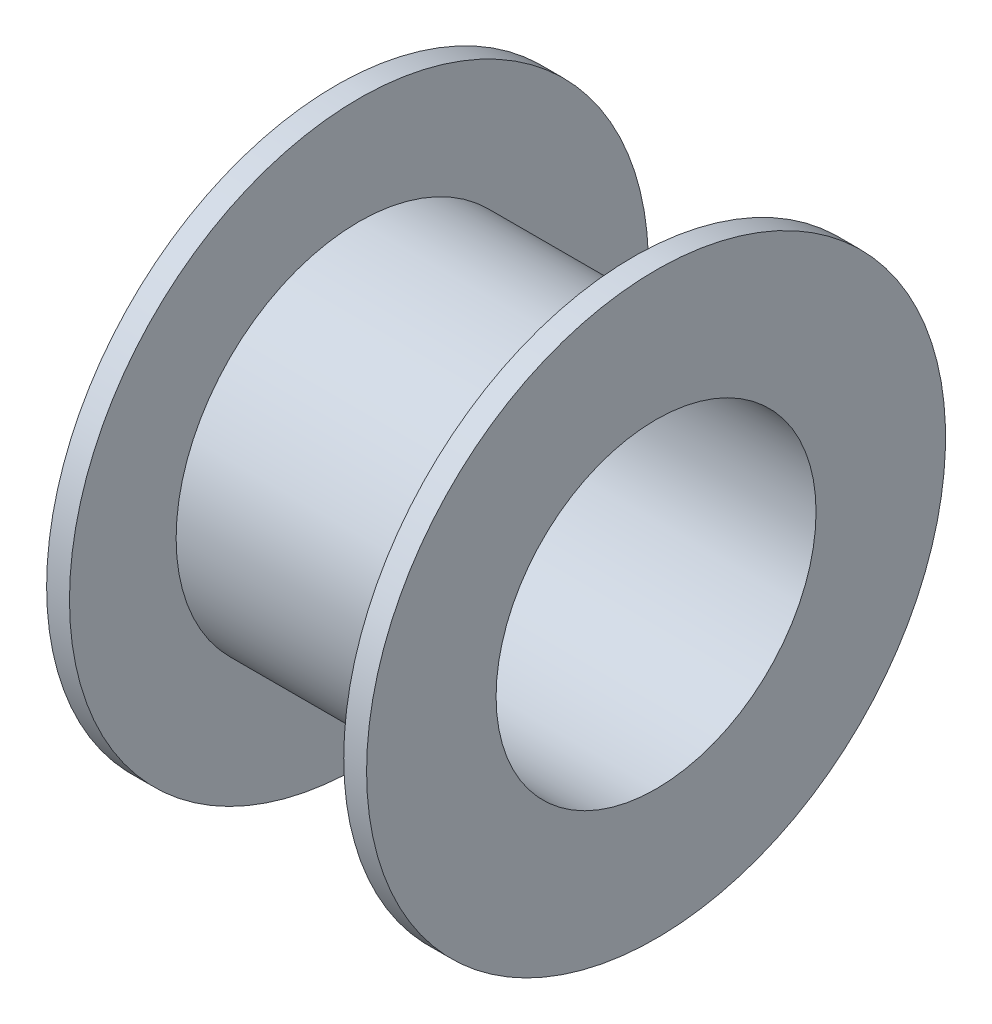
ISO-10303-21;
HEADER;
FILE_DESCRIPTION(('STEP AP214'),'2;1');
FILE_NAME('part.step','',(''),(''),'','','');
FILE_SCHEMA(('AUTOMOTIVE_DESIGN { 1 0 10303 214 1 1 1 1 }'));
ENDSEC;
DATA;
#1=APPLICATION_CONTEXT('core data for automotive mechanical design processes');
#2=APPLICATION_PROTOCOL_DEFINITION('international standard','automotive_design',2000,#1);
#3=PRODUCT_CONTEXT('',#1,'mechanical');
#4=PRODUCT('Part','Part','',(#3));
#5=PRODUCT_RELATED_PRODUCT_CATEGORY('part','',(#4));
#6=PRODUCT_DEFINITION_FORMATION('','',#4);
#7=PRODUCT_DEFINITION_CONTEXT('part definition',#1,'design');
#8=PRODUCT_DEFINITION('design','',#6,#7);
#9=PRODUCT_DEFINITION_SHAPE('','',#8);
#10=(LENGTH_UNIT() NAMED_UNIT(*) SI_UNIT(.MILLI.,.METRE.));
#11=(NAMED_UNIT(*) PLANE_ANGLE_UNIT() SI_UNIT($,.RADIAN.));
#12=(NAMED_UNIT(*) SI_UNIT($,.STERADIAN.) SOLID_ANGLE_UNIT());
#13=UNCERTAINTY_MEASURE_WITH_UNIT(LENGTH_MEASURE(1.E-05),#10,'distance_accuracy_value','');
#14=(GEOMETRIC_REPRESENTATION_CONTEXT(3) GLOBAL_UNCERTAINTY_ASSIGNED_CONTEXT((#13)) GLOBAL_UNIT_ASSIGNED_CONTEXT((#10,
#11,#12)) REPRESENTATION_CONTEXT('',''));
#15=CARTESIAN_POINT('',(0.,0.,0.));
#16=DIRECTION('',(0.,0.,1.));
#17=DIRECTION('',(1.,0.,0.));
#18=AXIS2_PLACEMENT_3D('',#15,#16,#17);
#19=CARTESIAN_POINT('',(21.,10.5,0.));
#20=DIRECTION('',(-1.,0.,0.));
#21=DIRECTION('',(0.,0.,1.));
#22=AXIS2_PLACEMENT_3D('',#19,#20,#21);
#23=PLANE('',#22);
#24=CARTESIAN_POINT('',(21.,0.,0.));
#25=DIRECTION('',(-1.,0.,0.));
#26=DIRECTION('',(0.,0.,1.));
#27=AXIS2_PLACEMENT_3D('',#24,#25,#26);
#28=CIRCLE('',#27,19.);
#29=CARTESIAN_POINT('',(21.,0.,19.));
#30=VERTEX_POINT('',#29);
#31=EDGE_CURVE('E55',#30,#30,#28,.T.);
#32=ORIENTED_EDGE('',*,*,#31,.F.);
#33=EDGE_LOOP('',(#32));
#34=FACE_BOUND('',#33,.T.);
#35=CARTESIAN_POINT('',(21.,0.,0.));
#36=DIRECTION('',(-1.,0.,0.));
#37=DIRECTION('',(0.,0.,1.));
#38=AXIS2_PLACEMENT_3D('',#35,#36,#37);
#39=CIRCLE('',#38,10.5);
#40=CARTESIAN_POINT('',(21.,0.,10.5));
#41=VERTEX_POINT('',#40);
#42=EDGE_CURVE('E10',#41,#41,#39,.T.);
#43=ORIENTED_EDGE('',*,*,#42,.T.);
#44=EDGE_LOOP('',(#43));
#45=FACE_BOUND('',#44,.T.);
#46=ADVANCED_FACE('F27',(#34,#45),#23,.F.);
#47=CARTESIAN_POINT('',(-23.8371251292658,0.,0.));
#48=DIRECTION('',(-1.,0.,0.));
#49=DIRECTION('',(0.,0.,1.));
#50=AXIS2_PLACEMENT_3D('',#47,#48,#49);
#51=CYLINDRICAL_SURFACE('',#50,10.5);
#52=ORIENTED_EDGE('',*,*,#42,.F.);
#53=EDGE_LOOP('',(#52));
#54=FACE_BOUND('',#53,.T.);
#55=CARTESIAN_POINT('',(0.,0.,0.));
#56=DIRECTION('',(-1.,0.,0.));
#57=DIRECTION('',(0.,0.,1.));
#58=AXIS2_PLACEMENT_3D('',#55,#56,#57);
#59=CIRCLE('',#58,10.5);
#60=CARTESIAN_POINT('',(0.,0.,10.5));
#61=VERTEX_POINT('',#60);
#62=EDGE_CURVE('E33',#61,#61,#59,.T.);
#63=ORIENTED_EDGE('',*,*,#62,.T.);
#64=EDGE_LOOP('',(#63));
#65=FACE_BOUND('',#64,.T.);
#66=ADVANCED_FACE('F62',(#54,#65),#51,.F.);
#67=CARTESIAN_POINT('',(0.,10.5,0.));
#68=DIRECTION('',(1.,0.,0.));
#69=DIRECTION('',(0.,0.,-1.));
#70=AXIS2_PLACEMENT_3D('',#67,#68,#69);
#71=PLANE('',#70);
#72=ORIENTED_EDGE('',*,*,#62,.F.);
#73=EDGE_LOOP('',(#72));
#74=FACE_BOUND('',#73,.T.);
#75=CARTESIAN_POINT('',(0.,0.,0.));
#76=DIRECTION('',(-1.,0.,0.));
#77=DIRECTION('',(0.,0.,1.));
#78=AXIS2_PLACEMENT_3D('',#75,#76,#77);
#79=CIRCLE('',#78,19.);
#80=CARTESIAN_POINT('',(0.,0.,19.));
#81=VERTEX_POINT('',#80);
#82=EDGE_CURVE('E37',#81,#81,#79,.T.);
#83=ORIENTED_EDGE('',*,*,#82,.T.);
#84=EDGE_LOOP('',(#83));
#85=FACE_BOUND('',#84,.T.);
#86=ADVANCED_FACE('F66',(#74,#85),#71,.F.);
#87=CARTESIAN_POINT('',(-23.8371251292658,0.,0.));
#88=DIRECTION('',(-1.,0.,0.));
#89=DIRECTION('',(0.,0.,1.));
#90=AXIS2_PLACEMENT_3D('',#87,#88,#89);
#91=CYLINDRICAL_SURFACE('',#90,19.);
#92=ORIENTED_EDGE('',*,*,#82,.F.);
#93=EDGE_LOOP('',(#92));
#94=FACE_BOUND('',#93,.T.);
#95=CARTESIAN_POINT('',(1.5,0.,0.));
#96=DIRECTION('',(-1.,0.,0.));
#97=DIRECTION('',(0.,0.,1.));
#98=AXIS2_PLACEMENT_3D('',#95,#96,#97);
#99=CIRCLE('',#98,19.);
#100=CARTESIAN_POINT('',(1.5,0.,19.));
#101=VERTEX_POINT('',#100);
#102=EDGE_CURVE('E41',#101,#101,#99,.T.);
#103=ORIENTED_EDGE('',*,*,#102,.T.);
#104=EDGE_LOOP('',(#103));
#105=FACE_BOUND('',#104,.T.);
#106=ADVANCED_FACE('F71',(#94,#105),#91,.T.);
#107=CARTESIAN_POINT('',(1.5,19.,0.));
#108=DIRECTION('',(-1.,0.,0.));
#109=DIRECTION('',(0.,0.,1.));
#110=AXIS2_PLACEMENT_3D('',#107,#108,#109);
#111=PLANE('',#110);
#112=ORIENTED_EDGE('',*,*,#102,.F.);
#113=EDGE_LOOP('',(#112));
#114=FACE_BOUND('',#113,.T.);
#115=CARTESIAN_POINT('',(1.5,0.,0.));
#116=DIRECTION('',(-1.,0.,0.));
#117=DIRECTION('',(0.,0.,1.));
#118=AXIS2_PLACEMENT_3D('',#115,#116,#117);
#119=CIRCLE('',#118,12.);
#120=CARTESIAN_POINT('',(1.5,0.,12.));
#121=VERTEX_POINT('',#120);
#122=EDGE_CURVE('E46',#121,#121,#119,.T.);
#123=ORIENTED_EDGE('',*,*,#122,.T.);
#124=EDGE_LOOP('',(#123));
#125=FACE_BOUND('',#124,.T.);
#126=ADVANCED_FACE('F77',(#114,#125),#111,.F.);
#127=CARTESIAN_POINT('',(-23.8371251292658,0.,0.));
#128=DIRECTION('',(-1.,0.,0.));
#129=DIRECTION('',(0.,0.,1.));
#130=AXIS2_PLACEMENT_3D('',#127,#128,#129);
#131=CYLINDRICAL_SURFACE('',#130,12.);
#132=ORIENTED_EDGE('',*,*,#122,.F.);
#133=EDGE_LOOP('',(#132));
#134=FACE_BOUND('',#133,.T.);
#135=CARTESIAN_POINT('',(19.5,0.,0.));
#136=DIRECTION('',(-1.,0.,0.));
#137=DIRECTION('',(0.,0.,1.));
#138=AXIS2_PLACEMENT_3D('',#135,#136,#137);
#139=CIRCLE('',#138,12.);
#140=CARTESIAN_POINT('',(19.5,0.,12.));
#141=VERTEX_POINT('',#140);
#142=EDGE_CURVE('E49',#141,#141,#139,.T.);
#143=ORIENTED_EDGE('',*,*,#142,.T.);
#144=EDGE_LOOP('',(#143));
#145=FACE_BOUND('',#144,.T.);
#146=ADVANCED_FACE('F81',(#134,#145),#131,.T.);
#147=CARTESIAN_POINT('',(19.5,19.,0.));
#148=DIRECTION('',(1.,0.,0.));
#149=DIRECTION('',(0.,0.,-1.));
#150=AXIS2_PLACEMENT_3D('',#147,#148,#149);
#151=PLANE('',#150);
#152=ORIENTED_EDGE('',*,*,#142,.F.);
#153=EDGE_LOOP('',(#152));
#154=FACE_BOUND('',#153,.T.);
#155=CARTESIAN_POINT('',(19.5,0.,0.));
#156=DIRECTION('',(-1.,0.,0.));
#157=DIRECTION('',(0.,0.,1.));
#158=AXIS2_PLACEMENT_3D('',#155,#156,#157);
#159=CIRCLE('',#158,19.);
#160=CARTESIAN_POINT('',(19.5,0.,19.));
#161=VERTEX_POINT('',#160);
#162=EDGE_CURVE('E52',#161,#161,#159,.T.);
#163=ORIENTED_EDGE('',*,*,#162,.T.);
#164=EDGE_LOOP('',(#163));
#165=FACE_BOUND('',#164,.T.);
#166=ADVANCED_FACE('F85',(#154,#165),#151,.F.);
#167=CARTESIAN_POINT('',(-23.8371251292658,0.,0.));
#168=DIRECTION('',(-1.,0.,0.));
#169=DIRECTION('',(0.,0.,1.));
#170=AXIS2_PLACEMENT_3D('',#167,#168,#169);
#171=CYLINDRICAL_SURFACE('',#170,19.);
#172=ORIENTED_EDGE('',*,*,#162,.F.);
#173=EDGE_LOOP('',(#172));
#174=FACE_BOUND('',#173,.T.);
#175=ORIENTED_EDGE('',*,*,#31,.T.);
#176=EDGE_LOOP('',(#175));
#177=FACE_BOUND('',#176,.T.);
#178=ADVANCED_FACE('F59',(#174,#177),#171,.T.);
#179=CLOSED_SHELL('',(#46,#66,#86,#106,#126,#146,#166,#178));
#180=MANIFOLD_SOLID_BREP('B2',#179);
#181=ADVANCED_BREP_SHAPE_REPRESENTATION('',(#18,#180),#14);
#182=SHAPE_DEFINITION_REPRESENTATION(#9,#181);
ENDSEC;
END-ISO-10303-21;
